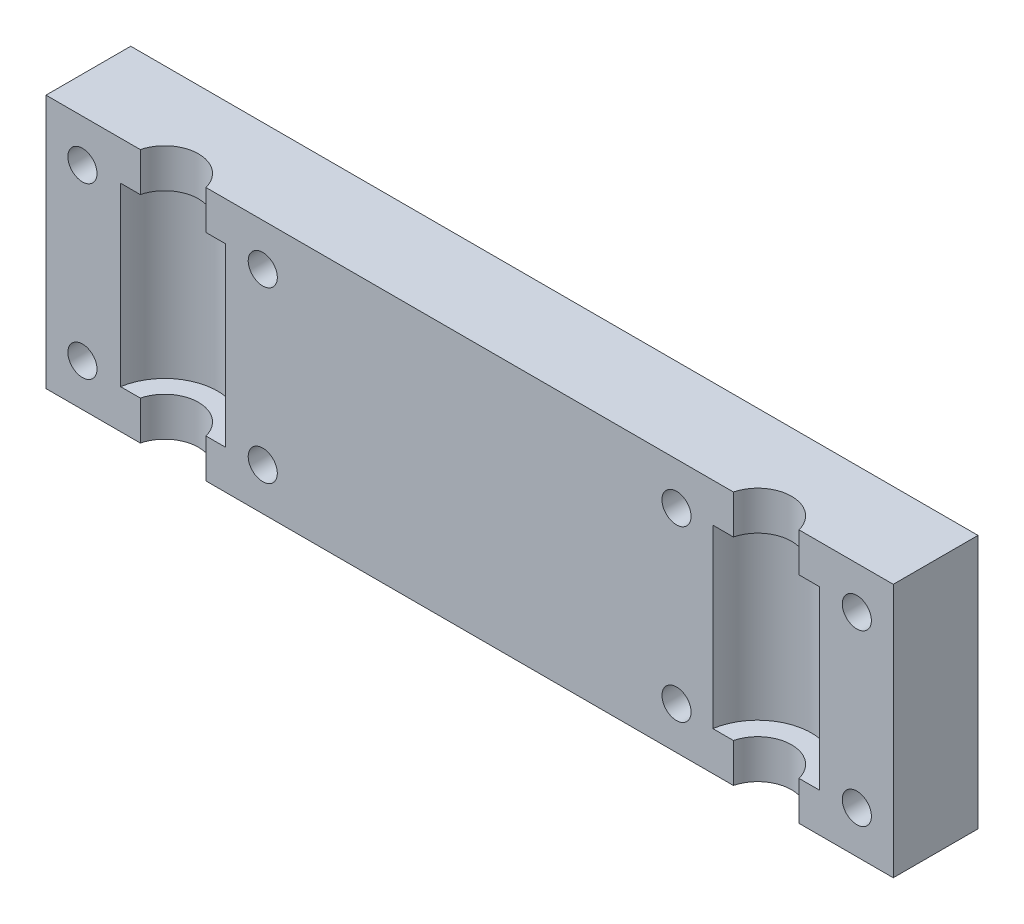
ISO-10303-21;
HEADER;
FILE_DESCRIPTION(('STEP AP214'),'2;1');
FILE_NAME('part.step','',(''),(''),'','','');
FILE_SCHEMA(('AUTOMOTIVE_DESIGN { 1 0 10303 214 1 1 1 1 }'));
ENDSEC;
DATA;
#1=APPLICATION_CONTEXT('core data for automotive mechanical design processes');
#2=APPLICATION_PROTOCOL_DEFINITION('international standard','automotive_design',2000,#1);
#3=PRODUCT_CONTEXT('',#1,'mechanical');
#4=PRODUCT('Part','Part','',(#3));
#5=PRODUCT_RELATED_PRODUCT_CATEGORY('part','',(#4));
#6=PRODUCT_DEFINITION_FORMATION('','',#4);
#7=PRODUCT_DEFINITION_CONTEXT('part definition',#1,'design');
#8=PRODUCT_DEFINITION('design','',#6,#7);
#9=PRODUCT_DEFINITION_SHAPE('','',#8);
#10=(LENGTH_UNIT() NAMED_UNIT(*) SI_UNIT(.MILLI.,.METRE.));
#11=(NAMED_UNIT(*) PLANE_ANGLE_UNIT() SI_UNIT($,.RADIAN.));
#12=(NAMED_UNIT(*) SI_UNIT($,.STERADIAN.) SOLID_ANGLE_UNIT());
#13=UNCERTAINTY_MEASURE_WITH_UNIT(LENGTH_MEASURE(1.E-05),#10,'distance_accuracy_value','');
#14=(GEOMETRIC_REPRESENTATION_CONTEXT(3) GLOBAL_UNCERTAINTY_ASSIGNED_CONTEXT((#13)) GLOBAL_UNIT_ASSIGNED_CONTEXT((#10,
#11,#12)) REPRESENTATION_CONTEXT('',''));
#15=CARTESIAN_POINT('',(0.,0.,0.));
#16=DIRECTION('',(0.,0.,1.));
#17=DIRECTION('',(1.,0.,0.));
#18=AXIS2_PLACEMENT_3D('',#15,#16,#17);
#19=CARTESIAN_POINT('',(-63.5,38.1,12.7));
#20=DIRECTION('',(0.,0.,-1.));
#21=DIRECTION('',(-1.,0.,0.));
#22=AXIS2_PLACEMENT_3D('',#19,#20,#21);
#23=PLANE('',#22);
#24=CARTESIAN_POINT('',(31.0092321055388,31.75,12.7));
#25=DIRECTION('',(0.,0.,-1.));
#26=DIRECTION('',(-1.,0.,0.));
#27=AXIS2_PLACEMENT_3D('',#24,#25,#26);
#28=CIRCLE('',#27,2.18287599999999);
#29=CARTESIAN_POINT('',(28.8263561055388,31.75,12.7));
#30=VERTEX_POINT('',#29);
#31=EDGE_CURVE('E246',#30,#30,#28,.T.);
#32=ORIENTED_EDGE('',*,*,#31,.T.);
#33=EDGE_LOOP('',(#32));
#34=FACE_BOUND('',#33,.T.);
#35=CARTESIAN_POINT('',(31.0092321055388,6.35,12.7));
#36=DIRECTION('',(0.,0.,-1.));
#37=DIRECTION('',(-1.,0.,0.));
#38=AXIS2_PLACEMENT_3D('',#35,#36,#37);
#39=CIRCLE('',#38,2.18287599999999);
#40=CARTESIAN_POINT('',(28.8263561055388,6.35,12.7));
#41=VERTEX_POINT('',#40);
#42=EDGE_CURVE('E242',#41,#41,#39,.T.);
#43=ORIENTED_EDGE('',*,*,#42,.T.);
#44=EDGE_LOOP('',(#43));
#45=FACE_BOUND('',#44,.T.);
#46=CARTESIAN_POINT('',(-31.0092321055388,31.75,12.7));
#47=DIRECTION('',(0.,0.,-1.));
#48=DIRECTION('',(-1.,0.,0.));
#49=AXIS2_PLACEMENT_3D('',#46,#47,#48);
#50=CIRCLE('',#49,2.18287599999999);
#51=CARTESIAN_POINT('',(-33.1921081055388,31.75,12.7));
#52=VERTEX_POINT('',#51);
#53=EDGE_CURVE('E238',#52,#52,#50,.T.);
#54=ORIENTED_EDGE('',*,*,#53,.T.);
#55=EDGE_LOOP('',(#54));
#56=FACE_BOUND('',#55,.T.);
#57=CARTESIAN_POINT('',(-31.0092321055388,6.35,12.7));
#58=DIRECTION('',(0.,0.,-1.));
#59=DIRECTION('',(-1.,0.,0.));
#60=AXIS2_PLACEMENT_3D('',#57,#58,#59);
#61=CIRCLE('',#60,2.18287599999999);
#62=CARTESIAN_POINT('',(-33.1921081055388,6.35,12.7));
#63=VERTEX_POINT('',#62);
#64=EDGE_CURVE('E234',#63,#63,#61,.T.);
#65=ORIENTED_EDGE('',*,*,#64,.T.);
#66=EDGE_LOOP('',(#65));
#67=FACE_BOUND('',#66,.T.);
#68=DIRECTION('',(1.,0.,0.));
#69=VECTOR('',#68,1.);
#70=CARTESIAN_POINT('',(-63.5,0.,12.7));
#71=LINE('',#70,#69);
#72=CARTESIAN_POINT('',(-39.5313111503166,0.,12.7));
#73=VERTEX_POINT('',#72);
#74=CARTESIAN_POINT('',(39.5313111503166,0.,12.7));
#75=VERTEX_POINT('',#74);
#76=EDGE_CURVE('E172',#73,#75,#71,.T.);
#77=ORIENTED_EDGE('',*,*,#76,.T.);
#78=DIRECTION('',(0.,1.,0.));
#79=VECTOR('',#78,1.);
#80=CARTESIAN_POINT('',(39.5313111503166,0.,12.7));
#81=LINE('',#80,#79);
#82=CARTESIAN_POINT('',(39.5313111503166,5.842,12.7));
#83=VERTEX_POINT('',#82);
#84=EDGE_CURVE('E150',#75,#83,#81,.T.);
#85=ORIENTED_EDGE('',*,*,#84,.T.);
#86=DIRECTION('',(1.,0.,0.));
#87=VECTOR('',#86,1.);
#88=CARTESIAN_POINT('',(-63.5,5.842,12.7));
#89=LINE('',#88,#87);
#90=CARTESIAN_POINT('',(36.4475487030535,5.842,12.7));
#91=VERTEX_POINT('',#90);
#92=EDGE_CURVE('E215',#91,#83,#89,.T.);
#93=ORIENTED_EDGE('',*,*,#92,.F.);
#94=DIRECTION('',(0.,-1.,0.));
#95=VECTOR('',#94,1.);
#96=CARTESIAN_POINT('',(36.4475487030535,32.258,12.7));
#97=LINE('',#96,#95);
#98=CARTESIAN_POINT('',(36.4475487030535,32.258,12.7));
#99=VERTEX_POINT('',#98);
#100=EDGE_CURVE('E218',#99,#91,#97,.T.);
#101=ORIENTED_EDGE('',*,*,#100,.F.);
#102=DIRECTION('',(1.,0.,0.));
#103=VECTOR('',#102,1.);
#104=CARTESIAN_POINT('',(-63.5,32.258,12.7));
#105=LINE('',#104,#103);
#106=CARTESIAN_POINT('',(39.5313111503166,32.258,12.7));
#107=VERTEX_POINT('',#106);
#108=EDGE_CURVE('E225',#99,#107,#105,.T.);
#109=ORIENTED_EDGE('',*,*,#108,.T.);
#110=CARTESIAN_POINT('',(39.5313111503166,38.1,12.7));
#111=VERTEX_POINT('',#110);
#112=EDGE_CURVE('E52',#107,#111,#81,.T.);
#113=ORIENTED_EDGE('',*,*,#112,.T.);
#114=DIRECTION('',(1.,0.,0.));
#115=VECTOR('',#114,1.);
#116=CARTESIAN_POINT('',(-63.5,38.1,12.7));
#117=LINE('',#116,#115);
#118=CARTESIAN_POINT('',(-39.5313111503166,38.1,12.7));
#119=VERTEX_POINT('',#118);
#120=EDGE_CURVE('E360',#119,#111,#117,.T.);
#121=ORIENTED_EDGE('',*,*,#120,.F.);
#122=DIRECTION('',(0.,1.,0.));
#123=VECTOR('',#122,1.);
#124=CARTESIAN_POINT('',(-39.5313111503166,0.,12.7));
#125=LINE('',#124,#123);
#126=CARTESIAN_POINT('',(-39.5313111503166,32.258,12.7));
#127=VERTEX_POINT('',#126);
#128=EDGE_CURVE('E290',#119,#127,#125,.F.);
#129=ORIENTED_EDGE('',*,*,#128,.T.);
#130=DIRECTION('',(1.,0.,0.));
#131=VECTOR('',#130,1.);
#132=CARTESIAN_POINT('',(-63.5,32.258,12.7));
#133=LINE('',#132,#131);
#134=CARTESIAN_POINT('',(-36.576163872673,32.258,12.7));
#135=VERTEX_POINT('',#134);
#136=EDGE_CURVE('E211',#127,#135,#133,.T.);
#137=ORIENTED_EDGE('',*,*,#136,.T.);
#138=DIRECTION('',(0.,-1.,0.));
#139=VECTOR('',#138,1.);
#140=CARTESIAN_POINT('',(-36.576163872673,32.258,12.7));
#141=LINE('',#140,#139);
#142=CARTESIAN_POINT('',(-36.576163872673,5.842,12.7));
#143=VERTEX_POINT('',#142);
#144=EDGE_CURVE('E208',#143,#135,#141,.F.);
#145=ORIENTED_EDGE('',*,*,#144,.F.);
#146=DIRECTION('',(1.,0.,0.));
#147=VECTOR('',#146,1.);
#148=CARTESIAN_POINT('',(-63.5,5.842,12.7));
#149=LINE('',#148,#147);
#150=CARTESIAN_POINT('',(-39.5313111503166,5.842,12.7));
#151=VERTEX_POINT('',#150);
#152=EDGE_CURVE('E201',#151,#143,#149,.T.);
#153=ORIENTED_EDGE('',*,*,#152,.F.);
#154=EDGE_CURVE('E284',#151,#73,#125,.F.);
#155=ORIENTED_EDGE('',*,*,#154,.T.);
#156=EDGE_LOOP('',(#77,#85,#93,#101,#109,#113,#121,#129,#137,#145,#153,#155));
#157=FACE_BOUND('',#156,.T.);
#158=ADVANCED_FACE('F35',(#34,#45,#56,#67,#157),#23,.F.);
#159=CARTESIAN_POINT('',(-58.039,6.35,12.7));
#160=DIRECTION('',(0.,0.,-1.));
#161=DIRECTION('',(-1.,0.,0.));
#162=AXIS2_PLACEMENT_3D('',#159,#160,#161);
#163=CIRCLE('',#162,2.18287599999999);
#164=CARTESIAN_POINT('',(-60.221876,6.35,12.7));
#165=VERTEX_POINT('',#164);
#166=EDGE_CURVE('E233',#165,#165,#163,.T.);
#167=ORIENTED_EDGE('',*,*,#166,.T.);
#168=EDGE_LOOP('',(#167));
#169=FACE_BOUND('',#168,.T.);
#170=CARTESIAN_POINT('',(-58.039,31.75,12.7));
#171=DIRECTION('',(0.,0.,-1.));
#172=DIRECTION('',(-1.,0.,0.));
#173=AXIS2_PLACEMENT_3D('',#170,#171,#172);
#174=CIRCLE('',#173,2.18287599999999);
#175=CARTESIAN_POINT('',(-60.221876,31.75,12.7));
#176=VERTEX_POINT('',#175);
#177=EDGE_CURVE('E229',#176,#176,#174,.T.);
#178=ORIENTED_EDGE('',*,*,#177,.T.);
#179=EDGE_LOOP('',(#178));
#180=FACE_BOUND('',#179,.T.);
#181=CARTESIAN_POINT('',(-63.5,0.,12.7));
#182=VERTEX_POINT('',#181);
#183=CARTESIAN_POINT('',(-49.3686888496834,0.,12.7));
#184=VERTEX_POINT('',#183);
#185=EDGE_CURVE('E175',#182,#184,#71,.T.);
#186=ORIENTED_EDGE('',*,*,#185,.T.);
#187=DIRECTION('',(0.,1.,0.));
#188=VECTOR('',#187,1.);
#189=CARTESIAN_POINT('',(-49.3686888496834,0.,12.7));
#190=LINE('',#189,#188);
#191=CARTESIAN_POINT('',(-49.3686888496834,5.842,12.7));
#192=VERTEX_POINT('',#191);
#193=EDGE_CURVE('E289',#184,#192,#190,.T.);
#194=ORIENTED_EDGE('',*,*,#193,.T.);
#195=CARTESIAN_POINT('',(-52.323836127327,5.842,12.7));
#196=VERTEX_POINT('',#195);
#197=EDGE_CURVE('E202',#196,#192,#149,.T.);
#198=ORIENTED_EDGE('',*,*,#197,.F.);
#199=DIRECTION('',(0.,-1.,0.));
#200=VECTOR('',#199,1.);
#201=CARTESIAN_POINT('',(-52.323836127327,32.258,12.7));
#202=LINE('',#201,#200);
#203=CARTESIAN_POINT('',(-52.323836127327,32.258,12.7));
#204=VERTEX_POINT('',#203);
#205=EDGE_CURVE('E205',#204,#196,#202,.T.);
#206=ORIENTED_EDGE('',*,*,#205,.F.);
#207=CARTESIAN_POINT('',(-49.3686888496834,32.258,12.7));
#208=VERTEX_POINT('',#207);
#209=EDGE_CURVE('E212',#204,#208,#133,.T.);
#210=ORIENTED_EDGE('',*,*,#209,.T.);
#211=CARTESIAN_POINT('',(-49.3686888496834,38.1,12.7));
#212=VERTEX_POINT('',#211);
#213=EDGE_CURVE('E293',#208,#212,#190,.T.);
#214=ORIENTED_EDGE('',*,*,#213,.T.);
#215=CARTESIAN_POINT('',(-63.5,38.1,12.7));
#216=VERTEX_POINT('',#215);
#217=EDGE_CURVE('E356',#216,#212,#117,.T.);
#218=ORIENTED_EDGE('',*,*,#217,.F.);
#219=DIRECTION('',(0.,-1.,0.));
#220=VECTOR('',#219,1.);
#221=CARTESIAN_POINT('',(-63.5,38.1,12.7));
#222=LINE('',#221,#220);
#223=EDGE_CURVE('E199',#216,#182,#222,.T.);
#224=ORIENTED_EDGE('',*,*,#223,.T.);
#225=EDGE_LOOP('',(#186,#194,#198,#206,#210,#214,#218,#224));
#226=FACE_BOUND('',#225,.T.);
#227=ADVANCED_FACE('F374',(#169,#180,#226),#23,.F.);
#228=CARTESIAN_POINT('',(-63.5,38.1,0.));
#229=DIRECTION('',(1.,0.,0.));
#230=DIRECTION('',(0.,0.,-1.));
#231=AXIS2_PLACEMENT_3D('',#228,#229,#230);
#232=PLANE('',#231);
#233=DIRECTION('',(0.,0.,1.));
#234=VECTOR('',#233,1.);
#235=CARTESIAN_POINT('',(-63.5,0.,0.));
#236=LINE('',#235,#234);
#237=CARTESIAN_POINT('',(-63.5,0.,0.));
#238=VERTEX_POINT('',#237);
#239=EDGE_CURVE('E173',#238,#182,#236,.T.);
#240=ORIENTED_EDGE('',*,*,#239,.T.);
#241=ORIENTED_EDGE('',*,*,#223,.F.);
#242=DIRECTION('',(0.,0.,1.));
#243=VECTOR('',#242,1.);
#244=CARTESIAN_POINT('',(-63.5,38.1,0.));
#245=LINE('',#244,#243);
#246=CARTESIAN_POINT('',(-63.5,38.1,0.));
#247=VERTEX_POINT('',#246);
#248=EDGE_CURVE('E188',#247,#216,#245,.T.);
#249=ORIENTED_EDGE('',*,*,#248,.F.);
#250=DIRECTION('',(0.,-1.,0.));
#251=VECTOR('',#250,1.);
#252=CARTESIAN_POINT('',(-63.5,38.1,0.));
#253=LINE('',#252,#251);
#254=EDGE_CURVE('E191',#247,#238,#253,.T.);
#255=ORIENTED_EDGE('',*,*,#254,.T.);
#256=EDGE_LOOP('',(#240,#241,#249,#255));
#257=FACE_BOUND('',#256,.T.);
#258=ADVANCED_FACE('F37',(#257),#232,.F.);
#259=CARTESIAN_POINT('',(58.039,31.75,12.7));
#260=DIRECTION('',(0.,0.,-1.));
#261=DIRECTION('',(-1.,0.,0.));
#262=AXIS2_PLACEMENT_3D('',#259,#260,#261);
#263=CIRCLE('',#262,2.18287599999999);
#264=CARTESIAN_POINT('',(55.856124,31.75,12.7));
#265=VERTEX_POINT('',#264);
#266=EDGE_CURVE('E39',#265,#265,#263,.T.);
#267=ORIENTED_EDGE('',*,*,#266,.T.);
#268=EDGE_LOOP('',(#267));
#269=FACE_BOUND('',#268,.T.);
#270=CARTESIAN_POINT('',(58.039,6.35,12.7));
#271=DIRECTION('',(0.,0.,-1.));
#272=DIRECTION('',(-1.,0.,0.));
#273=AXIS2_PLACEMENT_3D('',#270,#271,#272);
#274=CIRCLE('',#273,2.18287599999999);
#275=CARTESIAN_POINT('',(55.856124,6.35,12.7));
#276=VERTEX_POINT('',#275);
#277=EDGE_CURVE('E249',#276,#276,#274,.T.);
#278=ORIENTED_EDGE('',*,*,#277,.T.);
#279=EDGE_LOOP('',(#278));
#280=FACE_BOUND('',#279,.T.);
#281=CARTESIAN_POINT('',(49.3686888496834,38.1,12.7));
#282=VERTEX_POINT('',#281);
#283=CARTESIAN_POINT('',(63.5,38.1,12.7));
#284=VERTEX_POINT('',#283);
#285=EDGE_CURVE('E355',#282,#284,#117,.T.);
#286=ORIENTED_EDGE('',*,*,#285,.F.);
#287=DIRECTION('',(0.,1.,0.));
#288=VECTOR('',#287,1.);
#289=CARTESIAN_POINT('',(49.3686888496834,0.,12.7));
#290=LINE('',#289,#288);
#291=CARTESIAN_POINT('',(49.3686888496834,32.258,12.7));
#292=VERTEX_POINT('',#291);
#293=EDGE_CURVE('E167',#282,#292,#290,.F.);
#294=ORIENTED_EDGE('',*,*,#293,.T.);
#295=CARTESIAN_POINT('',(52.4524512969464,32.258,12.7));
#296=VERTEX_POINT('',#295);
#297=EDGE_CURVE('E224',#292,#296,#105,.T.);
#298=ORIENTED_EDGE('',*,*,#297,.T.);
#299=DIRECTION('',(0.,-1.,0.));
#300=VECTOR('',#299,1.);
#301=CARTESIAN_POINT('',(52.4524512969464,32.258,12.7));
#302=LINE('',#301,#300);
#303=CARTESIAN_POINT('',(52.4524512969464,5.842,12.7));
#304=VERTEX_POINT('',#303);
#305=EDGE_CURVE('E221',#304,#296,#302,.F.);
#306=ORIENTED_EDGE('',*,*,#305,.F.);
#307=CARTESIAN_POINT('',(49.3686888496834,5.842,12.7));
#308=VERTEX_POINT('',#307);
#309=EDGE_CURVE('E165',#308,#304,#89,.T.);
#310=ORIENTED_EDGE('',*,*,#309,.F.);
#311=CARTESIAN_POINT('',(49.3686888496834,0.,12.7));
#312=VERTEX_POINT('',#311);
#313=EDGE_CURVE('E59',#308,#312,#290,.F.);
#314=ORIENTED_EDGE('',*,*,#313,.T.);
#315=CARTESIAN_POINT('',(63.5,0.,12.7));
#316=VERTEX_POINT('',#315);
#317=EDGE_CURVE('E162',#312,#316,#71,.T.);
#318=ORIENTED_EDGE('',*,*,#317,.T.);
#319=DIRECTION('',(0.,-1.,0.));
#320=VECTOR('',#319,1.);
#321=CARTESIAN_POINT('',(63.5,38.1,12.7));
#322=LINE('',#321,#320);
#323=EDGE_CURVE('E197',#284,#316,#322,.T.);
#324=ORIENTED_EDGE('',*,*,#323,.F.);
#325=EDGE_LOOP('',(#286,#294,#298,#306,#310,#314,#318,#324));
#326=FACE_BOUND('',#325,.T.);
#327=ADVANCED_FACE('F160',(#269,#280,#326),#23,.F.);
#328=CARTESIAN_POINT('',(63.5,38.1,0.));
#329=DIRECTION('',(-1.,0.,0.));
#330=DIRECTION('',(0.,0.,1.));
#331=AXIS2_PLACEMENT_3D('',#328,#329,#330);
#332=PLANE('',#331);
#333=DIRECTION('',(0.,0.,-1.));
#334=VECTOR('',#333,1.);
#335=CARTESIAN_POINT('',(63.5,0.,0.));
#336=LINE('',#335,#334);
#337=CARTESIAN_POINT('',(63.5,0.,0.));
#338=VERTEX_POINT('',#337);
#339=EDGE_CURVE('E171',#316,#338,#336,.T.);
#340=ORIENTED_EDGE('',*,*,#339,.T.);
#341=DIRECTION('',(0.,-1.,0.));
#342=VECTOR('',#341,1.);
#343=CARTESIAN_POINT('',(63.5,38.1,0.));
#344=LINE('',#343,#342);
#345=CARTESIAN_POINT('',(63.5,38.1,0.));
#346=VERTEX_POINT('',#345);
#347=EDGE_CURVE('E194',#346,#338,#344,.T.);
#348=ORIENTED_EDGE('',*,*,#347,.F.);
#349=DIRECTION('',(0.,0.,-1.));
#350=VECTOR('',#349,1.);
#351=CARTESIAN_POINT('',(63.5,38.1,0.));
#352=LINE('',#351,#350);
#353=EDGE_CURVE('E359',#284,#346,#352,.T.);
#354=ORIENTED_EDGE('',*,*,#353,.F.);
#355=ORIENTED_EDGE('',*,*,#323,.T.);
#356=EDGE_LOOP('',(#340,#348,#354,#355));
#357=FACE_BOUND('',#356,.T.);
#358=ADVANCED_FACE('F384',(#357),#332,.F.);
#359=CARTESIAN_POINT('',(-63.5,38.1,0.));
#360=DIRECTION('',(0.,0.,1.));
#361=DIRECTION('',(1.,0.,0.));
#362=AXIS2_PLACEMENT_3D('',#359,#360,#361);
#363=PLANE('',#362);
#364=CARTESIAN_POINT('',(31.0092321055388,6.35,0.));
#365=DIRECTION('',(0.,0.,-1.));
#366=DIRECTION('',(-1.,0.,0.));
#367=AXIS2_PLACEMENT_3D('',#364,#365,#366);
#368=CIRCLE('',#367,4.445);
#369=CARTESIAN_POINT('',(26.5642321055388,6.35,0.));
#370=VERTEX_POINT('',#369);
#371=EDGE_CURVE('E307',#370,#370,#368,.T.);
#372=ORIENTED_EDGE('',*,*,#371,.F.);
#373=EDGE_LOOP('',(#372));
#374=FACE_BOUND('',#373,.T.);
#375=CARTESIAN_POINT('',(-31.0092321055388,31.75,0.));
#376=DIRECTION('',(0.,0.,-1.));
#377=DIRECTION('',(-1.,0.,0.));
#378=AXIS2_PLACEMENT_3D('',#375,#376,#377);
#379=CIRCLE('',#378,4.445);
#380=CARTESIAN_POINT('',(-35.4542321055388,31.75,0.));
#381=VERTEX_POINT('',#380);
#382=EDGE_CURVE('E313',#381,#381,#379,.T.);
#383=ORIENTED_EDGE('',*,*,#382,.F.);
#384=EDGE_LOOP('',(#383));
#385=FACE_BOUND('',#384,.T.);
#386=CARTESIAN_POINT('',(-31.0092321055388,6.35,0.));
#387=DIRECTION('',(0.,0.,-1.));
#388=DIRECTION('',(-1.,0.,0.));
#389=AXIS2_PLACEMENT_3D('',#386,#387,#388);
#390=CIRCLE('',#389,4.445);
#391=CARTESIAN_POINT('',(-35.4542321055388,6.35,0.));
#392=VERTEX_POINT('',#391);
#393=EDGE_CURVE('E319',#392,#392,#390,.T.);
#394=ORIENTED_EDGE('',*,*,#393,.F.);
#395=EDGE_LOOP('',(#394));
#396=FACE_BOUND('',#395,.T.);
#397=CARTESIAN_POINT('',(-58.039,6.35,0.));
#398=DIRECTION('',(0.,0.,-1.));
#399=DIRECTION('',(-1.,0.,0.));
#400=AXIS2_PLACEMENT_3D('',#397,#398,#399);
#401=CIRCLE('',#400,4.44499999999999);
#402=CARTESIAN_POINT('',(-62.484,6.35,0.));
#403=VERTEX_POINT('',#402);
#404=EDGE_CURVE('E325',#403,#403,#401,.T.);
#405=ORIENTED_EDGE('',*,*,#404,.F.);
#406=EDGE_LOOP('',(#405));
#407=FACE_BOUND('',#406,.T.);
#408=CARTESIAN_POINT('',(-58.039,31.75,0.));
#409=DIRECTION('',(0.,0.,-1.));
#410=DIRECTION('',(-1.,0.,0.));
#411=AXIS2_PLACEMENT_3D('',#408,#409,#410);
#412=CIRCLE('',#411,4.44499999999998);
#413=CARTESIAN_POINT('',(-62.484,31.75,0.));
#414=VERTEX_POINT('',#413);
#415=EDGE_CURVE('E331',#414,#414,#412,.T.);
#416=ORIENTED_EDGE('',*,*,#415,.F.);
#417=EDGE_LOOP('',(#416));
#418=FACE_BOUND('',#417,.T.);
#419=CARTESIAN_POINT('',(58.039,31.75,0.));
#420=DIRECTION('',(0.,0.,-1.));
#421=DIRECTION('',(-1.,0.,0.));
#422=AXIS2_PLACEMENT_3D('',#419,#420,#421);
#423=CIRCLE('',#422,4.44499999999998);
#424=CARTESIAN_POINT('',(53.594,31.75,0.));
#425=VERTEX_POINT('',#424);
#426=EDGE_CURVE('E337',#425,#425,#423,.T.);
#427=ORIENTED_EDGE('',*,*,#426,.F.);
#428=EDGE_LOOP('',(#427));
#429=FACE_BOUND('',#428,.T.);
#430=CARTESIAN_POINT('',(58.039,6.35,0.));
#431=DIRECTION('',(0.,0.,-1.));
#432=DIRECTION('',(-1.,0.,0.));
#433=AXIS2_PLACEMENT_3D('',#430,#431,#432);
#434=CIRCLE('',#433,4.44499999999999);
#435=CARTESIAN_POINT('',(53.594,6.35,0.));
#436=VERTEX_POINT('',#435);
#437=EDGE_CURVE('E343',#436,#436,#434,.T.);
#438=ORIENTED_EDGE('',*,*,#437,.F.);
#439=EDGE_LOOP('',(#438));
#440=FACE_BOUND('',#439,.T.);
#441=CARTESIAN_POINT('',(31.0092321055388,31.75,0.));
#442=DIRECTION('',(0.,0.,-1.));
#443=DIRECTION('',(-1.,0.,0.));
#444=AXIS2_PLACEMENT_3D('',#441,#442,#443);
#445=CIRCLE('',#444,4.445);
#446=CARTESIAN_POINT('',(26.5642321055388,31.75,0.));
#447=VERTEX_POINT('',#446);
#448=EDGE_CURVE('E346',#447,#447,#445,.T.);
#449=ORIENTED_EDGE('',*,*,#448,.F.);
#450=EDGE_LOOP('',(#449));
#451=FACE_BOUND('',#450,.T.);
#452=DIRECTION('',(-1.,0.,0.));
#453=VECTOR('',#452,1.);
#454=CARTESIAN_POINT('',(-63.5,0.,0.));
#455=LINE('',#454,#453);
#456=EDGE_CURVE('E184',#338,#238,#455,.T.);
#457=ORIENTED_EDGE('',*,*,#456,.T.);
#458=ORIENTED_EDGE('',*,*,#254,.F.);
#459=DIRECTION('',(-1.,0.,0.));
#460=VECTOR('',#459,1.);
#461=CARTESIAN_POINT('',(-63.5,38.1,0.));
#462=LINE('',#461,#460);
#463=EDGE_CURVE('E195',#346,#247,#462,.T.);
#464=ORIENTED_EDGE('',*,*,#463,.F.);
#465=ORIENTED_EDGE('',*,*,#347,.T.);
#466=EDGE_LOOP('',(#457,#458,#464,#465));
#467=FACE_BOUND('',#466,.T.);
#468=ADVANCED_FACE('F371',(#374,#385,#396,#407,#418,#429,#440,#451,#467),#363,.F.);
#469=CARTESIAN_POINT('',(0.,38.1,0.));
#470=DIRECTION('',(0.,1.,0.));
#471=DIRECTION('',(0.,0.,1.));
#472=AXIS2_PLACEMENT_3D('',#469,#470,#471);
#473=PLANE('',#472);
#474=CARTESIAN_POINT('',(44.45,38.1,13.97));
#475=DIRECTION('',(0.,1.,0.));
#476=DIRECTION('',(0.,0.,1.));
#477=AXIS2_PLACEMENT_3D('',#474,#475,#476);
#478=CIRCLE('',#477,5.08);
#479=EDGE_CURVE('E155',#282,#111,#478,.T.);
#480=ORIENTED_EDGE('',*,*,#479,.F.);
#481=ORIENTED_EDGE('',*,*,#285,.T.);
#482=ORIENTED_EDGE('',*,*,#353,.T.);
#483=ORIENTED_EDGE('',*,*,#463,.T.);
#484=ORIENTED_EDGE('',*,*,#248,.T.);
#485=ORIENTED_EDGE('',*,*,#217,.T.);
#486=CARTESIAN_POINT('',(-44.45,38.1,13.97));
#487=DIRECTION('',(0.,1.,0.));
#488=DIRECTION('',(0.,0.,1.));
#489=AXIS2_PLACEMENT_3D('',#486,#487,#488);
#490=CIRCLE('',#489,5.08);
#491=EDGE_CURVE('E285',#119,#212,#490,.T.);
#492=ORIENTED_EDGE('',*,*,#491,.F.);
#493=ORIENTED_EDGE('',*,*,#120,.T.);
#494=EDGE_LOOP('',(#480,#481,#482,#483,#484,#485,#492,#493));
#495=FACE_BOUND('',#494,.T.);
#496=ADVANCED_FACE('F366',(#495),#473,.T.);
#497=CARTESIAN_POINT('',(0.,0.,0.));
#498=DIRECTION('',(0.,1.,0.));
#499=DIRECTION('',(0.,0.,1.));
#500=AXIS2_PLACEMENT_3D('',#497,#498,#499);
#501=PLANE('',#500);
#502=ORIENTED_EDGE('',*,*,#317,.F.);
#503=CARTESIAN_POINT('',(44.45,0.,13.97));
#504=DIRECTION('',(0.,1.,0.));
#505=DIRECTION('',(0.,0.,1.));
#506=AXIS2_PLACEMENT_3D('',#503,#504,#505);
#507=CIRCLE('',#506,5.08);
#508=EDGE_CURVE('E147',#312,#75,#507,.T.);
#509=ORIENTED_EDGE('',*,*,#508,.T.);
#510=ORIENTED_EDGE('',*,*,#76,.F.);
#511=CARTESIAN_POINT('',(-44.45,0.,13.97));
#512=DIRECTION('',(0.,1.,0.));
#513=DIRECTION('',(0.,0.,1.));
#514=AXIS2_PLACEMENT_3D('',#511,#512,#513);
#515=CIRCLE('',#514,5.08);
#516=EDGE_CURVE('E281',#73,#184,#515,.T.);
#517=ORIENTED_EDGE('',*,*,#516,.T.);
#518=ORIENTED_EDGE('',*,*,#185,.F.);
#519=ORIENTED_EDGE('',*,*,#239,.F.);
#520=ORIENTED_EDGE('',*,*,#456,.F.);
#521=ORIENTED_EDGE('',*,*,#339,.F.);
#522=EDGE_LOOP('',(#502,#509,#510,#517,#518,#519,#520,#521));
#523=FACE_BOUND('',#522,.T.);
#524=ADVANCED_FACE('F169',(#523),#501,.F.);
#525=CARTESIAN_POINT('',(31.0092321055388,31.75,2.54));
#526=DIRECTION('',(0.,0.,-1.));
#527=DIRECTION('',(-1.,0.,0.));
#528=AXIS2_PLACEMENT_3D('',#525,#526,#527);
#529=CYLINDRICAL_SURFACE('',#528,4.445);
#530=CARTESIAN_POINT('',(31.0092321055388,31.75,2.54));
#531=DIRECTION('',(0.,0.,-1.));
#532=DIRECTION('',(-1.,0.,0.));
#533=AXIS2_PLACEMENT_3D('',#530,#531,#532);
#534=CIRCLE('',#533,4.445);
#535=CARTESIAN_POINT('',(26.5642321055388,31.75,2.54));
#536=VERTEX_POINT('',#535);
#537=EDGE_CURVE('E177',#536,#536,#534,.T.);
#538=ORIENTED_EDGE('',*,*,#537,.F.);
#539=EDGE_LOOP('',(#538));
#540=FACE_BOUND('',#539,.T.);
#541=ORIENTED_EDGE('',*,*,#448,.T.);
#542=EDGE_LOOP('',(#541));
#543=FACE_BOUND('',#542,.T.);
#544=ADVANCED_FACE('F547',(#540,#543),#529,.F.);
#545=CARTESIAN_POINT('',(31.0092321055388,31.75,2.54));
#546=DIRECTION('',(0.,0.,-1.));
#547=DIRECTION('',(-1.,0.,0.));
#548=AXIS2_PLACEMENT_3D('',#545,#546,#547);
#549=PLANE('',#548);
#550=CARTESIAN_POINT('',(31.0092321055388,31.75,2.54));
#551=DIRECTION('',(0.,0.,-1.));
#552=DIRECTION('',(-1.,0.,0.));
#553=AXIS2_PLACEMENT_3D('',#550,#551,#552);
#554=CIRCLE('',#553,2.18287599999999);
#555=CARTESIAN_POINT('',(28.8263561055388,31.75,2.54));
#556=VERTEX_POINT('',#555);
#557=EDGE_CURVE('E247',#556,#556,#554,.T.);
#558=ORIENTED_EDGE('',*,*,#557,.F.);
#559=EDGE_LOOP('',(#558));
#560=FACE_BOUND('',#559,.T.);
#561=ORIENTED_EDGE('',*,*,#537,.T.);
#562=EDGE_LOOP('',(#561));
#563=FACE_BOUND('',#562,.T.);
#564=ADVANCED_FACE('F540',(#560,#563),#549,.T.);
#565=CARTESIAN_POINT('',(58.039,6.35,2.54));
#566=DIRECTION('',(0.,0.,-1.));
#567=DIRECTION('',(-1.,0.,0.));
#568=AXIS2_PLACEMENT_3D('',#565,#566,#567);
#569=CYLINDRICAL_SURFACE('',#568,4.44499999999999);
#570=CARTESIAN_POINT('',(58.039,6.35,2.54));
#571=DIRECTION('',(0.,0.,-1.));
#572=DIRECTION('',(-1.,0.,0.));
#573=AXIS2_PLACEMENT_3D('',#570,#571,#572);
#574=CIRCLE('',#573,4.44499999999999);
#575=CARTESIAN_POINT('',(53.594,6.35,2.54));
#576=VERTEX_POINT('',#575);
#577=EDGE_CURVE('E340',#576,#576,#574,.T.);
#578=ORIENTED_EDGE('',*,*,#577,.F.);
#579=EDGE_LOOP('',(#578));
#580=FACE_BOUND('',#579,.T.);
#581=ORIENTED_EDGE('',*,*,#437,.T.);
#582=EDGE_LOOP('',(#581));
#583=FACE_BOUND('',#582,.T.);
#584=ADVANCED_FACE('F537',(#580,#583),#569,.F.);
#585=CARTESIAN_POINT('',(58.039,6.35,2.54));
#586=DIRECTION('',(0.,0.,-1.));
#587=DIRECTION('',(-1.,0.,0.));
#588=AXIS2_PLACEMENT_3D('',#585,#586,#587);
#589=PLANE('',#588);
#590=CARTESIAN_POINT('',(58.039,6.35,2.54));
#591=DIRECTION('',(0.,0.,-1.));
#592=DIRECTION('',(-1.,0.,0.));
#593=AXIS2_PLACEMENT_3D('',#590,#591,#592);
#594=CIRCLE('',#593,2.18287599999999);
#595=CARTESIAN_POINT('',(55.856124,6.35,2.54));
#596=VERTEX_POINT('',#595);
#597=EDGE_CURVE('E251',#596,#596,#594,.T.);
#598=ORIENTED_EDGE('',*,*,#597,.F.);
#599=EDGE_LOOP('',(#598));
#600=FACE_BOUND('',#599,.T.);
#601=ORIENTED_EDGE('',*,*,#577,.T.);
#602=EDGE_LOOP('',(#601));
#603=FACE_BOUND('',#602,.T.);
#604=ADVANCED_FACE('F532',(#600,#603),#589,.T.);
#605=CARTESIAN_POINT('',(58.039,31.75,2.54));
#606=DIRECTION('',(0.,0.,-1.));
#607=DIRECTION('',(-1.,0.,0.));
#608=AXIS2_PLACEMENT_3D('',#605,#606,#607);
#609=CYLINDRICAL_SURFACE('',#608,4.44499999999998);
#610=CARTESIAN_POINT('',(58.039,31.75,2.54));
#611=DIRECTION('',(0.,0.,-1.));
#612=DIRECTION('',(-1.,0.,0.));
#613=AXIS2_PLACEMENT_3D('',#610,#611,#612);
#614=CIRCLE('',#613,4.44499999999998);
#615=CARTESIAN_POINT('',(53.594,31.75,2.54));
#616=VERTEX_POINT('',#615);
#617=EDGE_CURVE('E334',#616,#616,#614,.T.);
#618=ORIENTED_EDGE('',*,*,#617,.F.);
#619=EDGE_LOOP('',(#618));
#620=FACE_BOUND('',#619,.T.);
#621=ORIENTED_EDGE('',*,*,#426,.T.);
#622=EDGE_LOOP('',(#621));
#623=FACE_BOUND('',#622,.T.);
#624=ADVANCED_FACE('F529',(#620,#623),#609,.F.);
#625=CARTESIAN_POINT('',(58.039,31.75,2.54));
#626=DIRECTION('',(0.,0.,-1.));
#627=DIRECTION('',(-1.,0.,0.));
#628=AXIS2_PLACEMENT_3D('',#625,#626,#627);
#629=PLANE('',#628);
#630=CARTESIAN_POINT('',(58.039,31.75,2.54));
#631=DIRECTION('',(0.,0.,-1.));
#632=DIRECTION('',(-1.,0.,0.));
#633=AXIS2_PLACEMENT_3D('',#630,#631,#632);
#634=CIRCLE('',#633,2.18287599999999);
#635=CARTESIAN_POINT('',(55.856124,31.75,2.54));
#636=VERTEX_POINT('',#635);
#637=EDGE_CURVE('E255',#636,#636,#634,.T.);
#638=ORIENTED_EDGE('',*,*,#637,.F.);
#639=EDGE_LOOP('',(#638));
#640=FACE_BOUND('',#639,.T.);
#641=ORIENTED_EDGE('',*,*,#617,.T.);
#642=EDGE_LOOP('',(#641));
#643=FACE_BOUND('',#642,.T.);
#644=ADVANCED_FACE('F524',(#640,#643),#629,.T.);
#645=CARTESIAN_POINT('',(-58.039,31.75,2.54));
#646=DIRECTION('',(0.,0.,-1.));
#647=DIRECTION('',(-1.,0.,0.));
#648=AXIS2_PLACEMENT_3D('',#645,#646,#647);
#649=CYLINDRICAL_SURFACE('',#648,4.44499999999998);
#650=CARTESIAN_POINT('',(-58.039,31.75,2.54));
#651=DIRECTION('',(0.,0.,-1.));
#652=DIRECTION('',(-1.,0.,0.));
#653=AXIS2_PLACEMENT_3D('',#650,#651,#652);
#654=CIRCLE('',#653,4.44499999999998);
#655=CARTESIAN_POINT('',(-62.484,31.75,2.54));
#656=VERTEX_POINT('',#655);
#657=EDGE_CURVE('E328',#656,#656,#654,.T.);
#658=ORIENTED_EDGE('',*,*,#657,.F.);
#659=EDGE_LOOP('',(#658));
#660=FACE_BOUND('',#659,.T.);
#661=ORIENTED_EDGE('',*,*,#415,.T.);
#662=EDGE_LOOP('',(#661));
#663=FACE_BOUND('',#662,.T.);
#664=ADVANCED_FACE('F521',(#660,#663),#649,.F.);
#665=CARTESIAN_POINT('',(-58.039,31.75,2.54));
#666=DIRECTION('',(0.,0.,-1.));
#667=DIRECTION('',(-1.,0.,0.));
#668=AXIS2_PLACEMENT_3D('',#665,#666,#667);
#669=PLANE('',#668);
#670=CARTESIAN_POINT('',(-58.039,31.75,2.54));
#671=DIRECTION('',(0.,0.,-1.));
#672=DIRECTION('',(-1.,0.,0.));
#673=AXIS2_PLACEMENT_3D('',#670,#671,#672);
#674=CIRCLE('',#673,2.18287599999999);
#675=CARTESIAN_POINT('',(-60.221876,31.75,2.54));
#676=VERTEX_POINT('',#675);
#677=EDGE_CURVE('E232',#676,#676,#674,.T.);
#678=ORIENTED_EDGE('',*,*,#677,.F.);
#679=EDGE_LOOP('',(#678));
#680=FACE_BOUND('',#679,.T.);
#681=ORIENTED_EDGE('',*,*,#657,.T.);
#682=EDGE_LOOP('',(#681));
#683=FACE_BOUND('',#682,.T.);
#684=ADVANCED_FACE('F516',(#680,#683),#669,.T.);
#685=CARTESIAN_POINT('',(-58.039,6.35,2.54));
#686=DIRECTION('',(0.,0.,-1.));
#687=DIRECTION('',(-1.,0.,0.));
#688=AXIS2_PLACEMENT_3D('',#685,#686,#687);
#689=CYLINDRICAL_SURFACE('',#688,4.44499999999999);
#690=CARTESIAN_POINT('',(-58.039,6.35,2.54));
#691=DIRECTION('',(0.,0.,-1.));
#692=DIRECTION('',(-1.,0.,0.));
#693=AXIS2_PLACEMENT_3D('',#690,#691,#692);
#694=CIRCLE('',#693,4.44499999999999);
#695=CARTESIAN_POINT('',(-62.484,6.35,2.54));
#696=VERTEX_POINT('',#695);
#697=EDGE_CURVE('E322',#696,#696,#694,.T.);
#698=ORIENTED_EDGE('',*,*,#697,.F.);
#699=EDGE_LOOP('',(#698));
#700=FACE_BOUND('',#699,.T.);
#701=ORIENTED_EDGE('',*,*,#404,.T.);
#702=EDGE_LOOP('',(#701));
#703=FACE_BOUND('',#702,.T.);
#704=ADVANCED_FACE('F513',(#700,#703),#689,.F.);
#705=CARTESIAN_POINT('',(-58.039,6.35,2.54));
#706=DIRECTION('',(0.,0.,-1.));
#707=DIRECTION('',(-1.,0.,0.));
#708=AXIS2_PLACEMENT_3D('',#705,#706,#707);
#709=PLANE('',#708);
#710=CARTESIAN_POINT('',(-58.039,6.35,2.54));
#711=DIRECTION('',(0.,0.,-1.));
#712=DIRECTION('',(-1.,0.,0.));
#713=AXIS2_PLACEMENT_3D('',#710,#711,#712);
#714=CIRCLE('',#713,2.18287599999999);
#715=CARTESIAN_POINT('',(-60.221876,6.35,2.54));
#716=VERTEX_POINT('',#715);
#717=EDGE_CURVE('E270',#716,#716,#714,.T.);
#718=ORIENTED_EDGE('',*,*,#717,.F.);
#719=EDGE_LOOP('',(#718));
#720=FACE_BOUND('',#719,.T.);
#721=ORIENTED_EDGE('',*,*,#697,.T.);
#722=EDGE_LOOP('',(#721));
#723=FACE_BOUND('',#722,.T.);
#724=ADVANCED_FACE('F508',(#720,#723),#709,.T.);
#725=CARTESIAN_POINT('',(-31.0092321055388,6.35,2.54));
#726=DIRECTION('',(0.,0.,-1.));
#727=DIRECTION('',(-1.,0.,0.));
#728=AXIS2_PLACEMENT_3D('',#725,#726,#727);
#729=CYLINDRICAL_SURFACE('',#728,4.445);
#730=CARTESIAN_POINT('',(-31.0092321055388,6.35,2.54));
#731=DIRECTION('',(0.,0.,-1.));
#732=DIRECTION('',(-1.,0.,0.));
#733=AXIS2_PLACEMENT_3D('',#730,#731,#732);
#734=CIRCLE('',#733,4.445);
#735=CARTESIAN_POINT('',(-35.4542321055388,6.35,2.54));
#736=VERTEX_POINT('',#735);
#737=EDGE_CURVE('E316',#736,#736,#734,.T.);
#738=ORIENTED_EDGE('',*,*,#737,.F.);
#739=EDGE_LOOP('',(#738));
#740=FACE_BOUND('',#739,.T.);
#741=ORIENTED_EDGE('',*,*,#393,.T.);
#742=EDGE_LOOP('',(#741));
#743=FACE_BOUND('',#742,.T.);
#744=ADVANCED_FACE('F505',(#740,#743),#729,.F.);
#745=CARTESIAN_POINT('',(-31.0092321055388,6.35,2.54));
#746=DIRECTION('',(0.,0.,-1.));
#747=DIRECTION('',(-1.,0.,0.));
#748=AXIS2_PLACEMENT_3D('',#745,#746,#747);
#749=PLANE('',#748);
#750=CARTESIAN_POINT('',(-31.0092321055388,6.35,2.54));
#751=DIRECTION('',(0.,0.,-1.));
#752=DIRECTION('',(-1.,0.,0.));
#753=AXIS2_PLACEMENT_3D('',#750,#751,#752);
#754=CIRCLE('',#753,2.18287599999999);
#755=CARTESIAN_POINT('',(-33.1921081055388,6.35,2.54));
#756=VERTEX_POINT('',#755);
#757=EDGE_CURVE('E237',#756,#756,#754,.T.);
#758=ORIENTED_EDGE('',*,*,#757,.F.);
#759=EDGE_LOOP('',(#758));
#760=FACE_BOUND('',#759,.T.);
#761=ORIENTED_EDGE('',*,*,#737,.T.);
#762=EDGE_LOOP('',(#761));
#763=FACE_BOUND('',#762,.T.);
#764=ADVANCED_FACE('F500',(#760,#763),#749,.T.);
#765=CARTESIAN_POINT('',(-31.0092321055388,31.75,2.54));
#766=DIRECTION('',(0.,0.,-1.));
#767=DIRECTION('',(-1.,0.,0.));
#768=AXIS2_PLACEMENT_3D('',#765,#766,#767);
#769=CYLINDRICAL_SURFACE('',#768,4.445);
#770=CARTESIAN_POINT('',(-31.0092321055388,31.75,2.54));
#771=DIRECTION('',(0.,0.,-1.));
#772=DIRECTION('',(-1.,0.,0.));
#773=AXIS2_PLACEMENT_3D('',#770,#771,#772);
#774=CIRCLE('',#773,4.445);
#775=CARTESIAN_POINT('',(-35.4542321055388,31.75,2.54));
#776=VERTEX_POINT('',#775);
#777=EDGE_CURVE('E310',#776,#776,#774,.T.);
#778=ORIENTED_EDGE('',*,*,#777,.F.);
#779=EDGE_LOOP('',(#778));
#780=FACE_BOUND('',#779,.T.);
#781=ORIENTED_EDGE('',*,*,#382,.T.);
#782=EDGE_LOOP('',(#781));
#783=FACE_BOUND('',#782,.T.);
#784=ADVANCED_FACE('F497',(#780,#783),#769,.F.);
#785=CARTESIAN_POINT('',(-31.0092321055388,31.75,2.54));
#786=DIRECTION('',(0.,0.,-1.));
#787=DIRECTION('',(-1.,0.,0.));
#788=AXIS2_PLACEMENT_3D('',#785,#786,#787);
#789=PLANE('',#788);
#790=CARTESIAN_POINT('',(-31.0092321055388,31.75,2.54));
#791=DIRECTION('',(0.,0.,-1.));
#792=DIRECTION('',(-1.,0.,0.));
#793=AXIS2_PLACEMENT_3D('',#790,#791,#792);
#794=CIRCLE('',#793,2.18287599999999);
#795=CARTESIAN_POINT('',(-33.1921081055388,31.75,2.54));
#796=VERTEX_POINT('',#795);
#797=EDGE_CURVE('E241',#796,#796,#794,.T.);
#798=ORIENTED_EDGE('',*,*,#797,.F.);
#799=EDGE_LOOP('',(#798));
#800=FACE_BOUND('',#799,.T.);
#801=ORIENTED_EDGE('',*,*,#777,.T.);
#802=EDGE_LOOP('',(#801));
#803=FACE_BOUND('',#802,.T.);
#804=ADVANCED_FACE('F492',(#800,#803),#789,.T.);
#805=CARTESIAN_POINT('',(31.0092321055388,6.35,2.54));
#806=DIRECTION('',(0.,0.,-1.));
#807=DIRECTION('',(-1.,0.,0.));
#808=AXIS2_PLACEMENT_3D('',#805,#806,#807);
#809=CYLINDRICAL_SURFACE('',#808,4.445);
#810=CARTESIAN_POINT('',(31.0092321055388,6.35,2.54));
#811=DIRECTION('',(0.,0.,-1.));
#812=DIRECTION('',(-1.,0.,0.));
#813=AXIS2_PLACEMENT_3D('',#810,#811,#812);
#814=CIRCLE('',#813,4.445);
#815=CARTESIAN_POINT('',(26.5642321055388,6.35,2.54));
#816=VERTEX_POINT('',#815);
#817=EDGE_CURVE('E306',#816,#816,#814,.T.);
#818=ORIENTED_EDGE('',*,*,#817,.F.);
#819=EDGE_LOOP('',(#818));
#820=FACE_BOUND('',#819,.T.);
#821=ORIENTED_EDGE('',*,*,#371,.T.);
#822=EDGE_LOOP('',(#821));
#823=FACE_BOUND('',#822,.T.);
#824=ADVANCED_FACE('F489',(#820,#823),#809,.F.);
#825=CARTESIAN_POINT('',(31.0092321055388,6.35,2.54));
#826=DIRECTION('',(0.,0.,-1.));
#827=DIRECTION('',(-1.,0.,0.));
#828=AXIS2_PLACEMENT_3D('',#825,#826,#827);
#829=PLANE('',#828);
#830=CARTESIAN_POINT('',(31.0092321055388,6.35,2.54));
#831=DIRECTION('',(0.,0.,-1.));
#832=DIRECTION('',(-1.,0.,0.));
#833=AXIS2_PLACEMENT_3D('',#830,#831,#832);
#834=CIRCLE('',#833,2.18287599999999);
#835=CARTESIAN_POINT('',(28.8263561055388,6.35,2.54));
#836=VERTEX_POINT('',#835);
#837=EDGE_CURVE('E245',#836,#836,#834,.T.);
#838=ORIENTED_EDGE('',*,*,#837,.F.);
#839=EDGE_LOOP('',(#838));
#840=FACE_BOUND('',#839,.T.);
#841=ORIENTED_EDGE('',*,*,#817,.T.);
#842=EDGE_LOOP('',(#841));
#843=FACE_BOUND('',#842,.T.);
#844=ADVANCED_FACE('F488',(#840,#843),#829,.T.);
#845=CARTESIAN_POINT('',(-44.45,32.258,13.97));
#846=DIRECTION('',(0.,-1.,0.));
#847=DIRECTION('',(0.,0.,-1.));
#848=AXIS2_PLACEMENT_3D('',#845,#846,#847);
#849=CYLINDRICAL_SURFACE('',#848,7.9756);
#850=ORIENTED_EDGE('',*,*,#144,.T.);
#851=CARTESIAN_POINT('',(-44.45,32.258,13.97));
#852=DIRECTION('',(0.,1.,0.));
#853=DIRECTION('',(0.,0.,1.));
#854=AXIS2_PLACEMENT_3D('',#851,#852,#853);
#855=CIRCLE('',#854,7.9756);
#856=EDGE_CURVE('E303',#135,#204,#855,.T.);
#857=ORIENTED_EDGE('',*,*,#856,.T.);
#858=ORIENTED_EDGE('',*,*,#205,.T.);
#859=CARTESIAN_POINT('',(-44.45,5.842,13.97));
#860=DIRECTION('',(0.,1.,0.));
#861=DIRECTION('',(0.,0.,1.));
#862=AXIS2_PLACEMENT_3D('',#859,#860,#861);
#863=CIRCLE('',#862,7.9756);
#864=EDGE_CURVE('E301',#143,#196,#863,.T.);
#865=ORIENTED_EDGE('',*,*,#864,.F.);
#866=EDGE_LOOP('',(#850,#857,#858,#865));
#867=FACE_BOUND('',#866,.T.);
#868=ADVANCED_FACE('F394',(#867),#849,.F.);
#869=CARTESIAN_POINT('',(-44.45,32.258,13.97));
#870=DIRECTION('',(0.,1.,0.));
#871=DIRECTION('',(0.,0.,1.));
#872=AXIS2_PLACEMENT_3D('',#869,#870,#871);
#873=PLANE('',#872);
#874=ORIENTED_EDGE('',*,*,#136,.F.);
#875=CARTESIAN_POINT('',(-44.45,32.258,13.97));
#876=DIRECTION('',(0.,1.,0.));
#877=DIRECTION('',(0.,0.,1.));
#878=AXIS2_PLACEMENT_3D('',#875,#876,#877);
#879=CIRCLE('',#878,5.08);
#880=EDGE_CURVE('E292',#127,#208,#879,.T.);
#881=ORIENTED_EDGE('',*,*,#880,.T.);
#882=ORIENTED_EDGE('',*,*,#209,.F.);
#883=ORIENTED_EDGE('',*,*,#856,.F.);
#884=EDGE_LOOP('',(#874,#881,#882,#883));
#885=FACE_BOUND('',#884,.T.);
#886=ADVANCED_FACE('F399',(#885),#873,.F.);
#887=CARTESIAN_POINT('',(-44.45,5.842,13.97));
#888=DIRECTION('',(0.,1.,0.));
#889=DIRECTION('',(0.,0.,1.));
#890=AXIS2_PLACEMENT_3D('',#887,#888,#889);
#891=PLANE('',#890);
#892=CARTESIAN_POINT('',(-44.45,5.842,13.97));
#893=DIRECTION('',(0.,1.,0.));
#894=DIRECTION('',(0.,0.,1.));
#895=AXIS2_PLACEMENT_3D('',#892,#893,#894);
#896=CIRCLE('',#895,5.08);
#897=EDGE_CURVE('E44',#151,#192,#896,.T.);
#898=ORIENTED_EDGE('',*,*,#897,.F.);
#899=ORIENTED_EDGE('',*,*,#152,.T.);
#900=ORIENTED_EDGE('',*,*,#864,.T.);
#901=ORIENTED_EDGE('',*,*,#197,.T.);
#902=EDGE_LOOP('',(#898,#899,#900,#901));
#903=FACE_BOUND('',#902,.T.);
#904=ADVANCED_FACE('F392',(#903),#891,.T.);
#905=CARTESIAN_POINT('',(44.45,32.258,13.97));
#906=DIRECTION('',(0.,-1.,0.));
#907=DIRECTION('',(0.,0.,-1.));
#908=AXIS2_PLACEMENT_3D('',#905,#906,#907);
#909=CYLINDRICAL_SURFACE('',#908,8.1026);
#910=ORIENTED_EDGE('',*,*,#305,.T.);
#911=CARTESIAN_POINT('',(44.45,32.258,13.97));
#912=DIRECTION('',(0.,1.,0.));
#913=DIRECTION('',(0.,0.,1.));
#914=AXIS2_PLACEMENT_3D('',#911,#912,#913);
#915=CIRCLE('',#914,8.1026);
#916=EDGE_CURVE('E298',#296,#99,#915,.T.);
#917=ORIENTED_EDGE('',*,*,#916,.T.);
#918=ORIENTED_EDGE('',*,*,#100,.T.);
#919=CARTESIAN_POINT('',(44.45,5.842,13.97));
#920=DIRECTION('',(0.,1.,0.));
#921=DIRECTION('',(0.,0.,1.));
#922=AXIS2_PLACEMENT_3D('',#919,#920,#921);
#923=CIRCLE('',#922,8.1026);
#924=EDGE_CURVE('E296',#304,#91,#923,.T.);
#925=ORIENTED_EDGE('',*,*,#924,.F.);
#926=EDGE_LOOP('',(#910,#917,#918,#925));
#927=FACE_BOUND('',#926,.T.);
#928=ADVANCED_FACE('F470',(#927),#909,.F.);
#929=CARTESIAN_POINT('',(44.45,32.258,13.97));
#930=DIRECTION('',(0.,1.,0.));
#931=DIRECTION('',(0.,0.,1.));
#932=AXIS2_PLACEMENT_3D('',#929,#930,#931);
#933=PLANE('',#932);
#934=ORIENTED_EDGE('',*,*,#297,.F.);
#935=CARTESIAN_POINT('',(44.45,32.258,13.97));
#936=DIRECTION('',(0.,1.,0.));
#937=DIRECTION('',(0.,0.,1.));
#938=AXIS2_PLACEMENT_3D('',#935,#936,#937);
#939=CIRCLE('',#938,5.08);
#940=EDGE_CURVE('E279',#292,#107,#939,.T.);
#941=ORIENTED_EDGE('',*,*,#940,.T.);
#942=ORIENTED_EDGE('',*,*,#108,.F.);
#943=ORIENTED_EDGE('',*,*,#916,.F.);
#944=EDGE_LOOP('',(#934,#941,#942,#943));
#945=FACE_BOUND('',#944,.T.);
#946=ADVANCED_FACE('F467',(#945),#933,.F.);
#947=CARTESIAN_POINT('',(44.45,5.842,13.97));
#948=DIRECTION('',(0.,1.,0.));
#949=DIRECTION('',(0.,0.,1.));
#950=AXIS2_PLACEMENT_3D('',#947,#948,#949);
#951=PLANE('',#950);
#952=CARTESIAN_POINT('',(44.45,5.842,13.97));
#953=DIRECTION('',(0.,1.,0.));
#954=DIRECTION('',(0.,0.,1.));
#955=AXIS2_PLACEMENT_3D('',#952,#953,#954);
#956=CIRCLE('',#955,5.08);
#957=EDGE_CURVE('E11',#308,#83,#956,.T.);
#958=ORIENTED_EDGE('',*,*,#957,.F.);
#959=ORIENTED_EDGE('',*,*,#309,.T.);
#960=ORIENTED_EDGE('',*,*,#924,.T.);
#961=ORIENTED_EDGE('',*,*,#92,.T.);
#962=EDGE_LOOP('',(#958,#959,#960,#961));
#963=FACE_BOUND('',#962,.T.);
#964=ADVANCED_FACE('F409',(#963),#951,.T.);
#965=CARTESIAN_POINT('',(-44.45,0.,13.97));
#966=DIRECTION('',(0.,1.,0.));
#967=DIRECTION('',(0.,0.,1.));
#968=AXIS2_PLACEMENT_3D('',#965,#966,#967);
#969=CYLINDRICAL_SURFACE('',#968,5.08);
#970=ORIENTED_EDGE('',*,*,#516,.F.);
#971=ORIENTED_EDGE('',*,*,#154,.F.);
#972=ORIENTED_EDGE('',*,*,#897,.T.);
#973=ORIENTED_EDGE('',*,*,#193,.F.);
#974=EDGE_LOOP('',(#970,#971,#972,#973));
#975=FACE_BOUND('',#974,.T.);
#976=ADVANCED_FACE('F386',(#975),#969,.F.);
#977=ORIENTED_EDGE('',*,*,#880,.F.);
#978=ORIENTED_EDGE('',*,*,#128,.F.);
#979=ORIENTED_EDGE('',*,*,#491,.T.);
#980=ORIENTED_EDGE('',*,*,#213,.F.);
#981=EDGE_LOOP('',(#977,#978,#979,#980));
#982=FACE_BOUND('',#981,.T.);
#983=ADVANCED_FACE('F400',(#982),#969,.F.);
#984=CARTESIAN_POINT('',(44.45,0.,13.97));
#985=DIRECTION('',(0.,1.,0.));
#986=DIRECTION('',(0.,0.,1.));
#987=AXIS2_PLACEMENT_3D('',#984,#985,#986);
#988=CYLINDRICAL_SURFACE('',#987,5.08);
#989=ORIENTED_EDGE('',*,*,#508,.F.);
#990=ORIENTED_EDGE('',*,*,#313,.F.);
#991=ORIENTED_EDGE('',*,*,#957,.T.);
#992=ORIENTED_EDGE('',*,*,#84,.F.);
#993=EDGE_LOOP('',(#989,#990,#991,#992));
#994=FACE_BOUND('',#993,.T.);
#995=ADVANCED_FACE('F148',(#994),#988,.F.);
#996=ORIENTED_EDGE('',*,*,#940,.F.);
#997=ORIENTED_EDGE('',*,*,#293,.F.);
#998=ORIENTED_EDGE('',*,*,#479,.T.);
#999=ORIENTED_EDGE('',*,*,#112,.F.);
#1000=EDGE_LOOP('',(#996,#997,#998,#999));
#1001=FACE_BOUND('',#1000,.T.);
#1002=ADVANCED_FACE('F407',(#1001),#988,.F.);
#1003=CARTESIAN_POINT('',(-58.039,31.75,0.));
#1004=DIRECTION('',(0.,0.,-1.));
#1005=DIRECTION('',(-1.,0.,0.));
#1006=AXIS2_PLACEMENT_3D('',#1003,#1004,#1005);
#1007=CYLINDRICAL_SURFACE('',#1006,2.18287599999999);
#1008=ORIENTED_EDGE('',*,*,#677,.T.);
#1009=EDGE_LOOP('',(#1008));
#1010=FACE_BOUND('',#1009,.T.);
#1011=ORIENTED_EDGE('',*,*,#177,.F.);
#1012=EDGE_LOOP('',(#1011));
#1013=FACE_BOUND('',#1012,.T.);
#1014=ADVANCED_FACE('F457',(#1010,#1013),#1007,.F.);
#1015=CARTESIAN_POINT('',(-58.039,6.35,2.54));
#1016=DIRECTION('',(0.,0.,-1.));
#1017=DIRECTION('',(-1.,0.,0.));
#1018=AXIS2_PLACEMENT_3D('',#1015,#1016,#1017);
#1019=CYLINDRICAL_SURFACE('',#1018,2.18287599999999);
#1020=ORIENTED_EDGE('',*,*,#717,.T.);
#1021=EDGE_LOOP('',(#1020));
#1022=FACE_BOUND('',#1021,.T.);
#1023=ORIENTED_EDGE('',*,*,#166,.F.);
#1024=EDGE_LOOP('',(#1023));
#1025=FACE_BOUND('',#1024,.T.);
#1026=ADVANCED_FACE('F453',(#1022,#1025),#1019,.F.);
#1027=CARTESIAN_POINT('',(-31.0092321055388,6.35,0.));
#1028=DIRECTION('',(0.,0.,-1.));
#1029=DIRECTION('',(-1.,0.,0.));
#1030=AXIS2_PLACEMENT_3D('',#1027,#1028,#1029);
#1031=CYLINDRICAL_SURFACE('',#1030,2.18287599999999);
#1032=ORIENTED_EDGE('',*,*,#757,.T.);
#1033=EDGE_LOOP('',(#1032));
#1034=FACE_BOUND('',#1033,.T.);
#1035=ORIENTED_EDGE('',*,*,#64,.F.);
#1036=EDGE_LOOP('',(#1035));
#1037=FACE_BOUND('',#1036,.T.);
#1038=ADVANCED_FACE('F449',(#1034,#1037),#1031,.F.);
#1039=CARTESIAN_POINT('',(-31.0092321055388,31.75,2.54));
#1040=DIRECTION('',(0.,0.,-1.));
#1041=DIRECTION('',(-1.,0.,0.));
#1042=AXIS2_PLACEMENT_3D('',#1039,#1040,#1041);
#1043=CYLINDRICAL_SURFACE('',#1042,2.18287599999999);
#1044=ORIENTED_EDGE('',*,*,#797,.T.);
#1045=EDGE_LOOP('',(#1044));
#1046=FACE_BOUND('',#1045,.T.);
#1047=ORIENTED_EDGE('',*,*,#53,.F.);
#1048=EDGE_LOOP('',(#1047));
#1049=FACE_BOUND('',#1048,.T.);
#1050=ADVANCED_FACE('F445',(#1046,#1049),#1043,.F.);
#1051=CARTESIAN_POINT('',(31.0092321055388,6.35,0.));
#1052=DIRECTION('',(0.,0.,-1.));
#1053=DIRECTION('',(-1.,0.,0.));
#1054=AXIS2_PLACEMENT_3D('',#1051,#1052,#1053);
#1055=CYLINDRICAL_SURFACE('',#1054,2.18287599999999);
#1056=ORIENTED_EDGE('',*,*,#837,.T.);
#1057=EDGE_LOOP('',(#1056));
#1058=FACE_BOUND('',#1057,.T.);
#1059=ORIENTED_EDGE('',*,*,#42,.F.);
#1060=EDGE_LOOP('',(#1059));
#1061=FACE_BOUND('',#1060,.T.);
#1062=ADVANCED_FACE('F441',(#1058,#1061),#1055,.F.);
#1063=CARTESIAN_POINT('',(31.0092321055388,31.75,0.));
#1064=DIRECTION('',(0.,0.,-1.));
#1065=DIRECTION('',(-1.,0.,0.));
#1066=AXIS2_PLACEMENT_3D('',#1063,#1064,#1065);
#1067=CYLINDRICAL_SURFACE('',#1066,2.18287599999999);
#1068=ORIENTED_EDGE('',*,*,#557,.T.);
#1069=EDGE_LOOP('',(#1068));
#1070=FACE_BOUND('',#1069,.T.);
#1071=ORIENTED_EDGE('',*,*,#31,.F.);
#1072=EDGE_LOOP('',(#1071));
#1073=FACE_BOUND('',#1072,.T.);
#1074=ADVANCED_FACE('F436',(#1070,#1073),#1067,.F.);
#1075=CARTESIAN_POINT('',(58.039,6.35,2.54));
#1076=DIRECTION('',(0.,0.,-1.));
#1077=DIRECTION('',(-1.,0.,0.));
#1078=AXIS2_PLACEMENT_3D('',#1075,#1076,#1077);
#1079=CYLINDRICAL_SURFACE('',#1078,2.18287599999999);
#1080=ORIENTED_EDGE('',*,*,#597,.T.);
#1081=EDGE_LOOP('',(#1080));
#1082=FACE_BOUND('',#1081,.T.);
#1083=ORIENTED_EDGE('',*,*,#277,.F.);
#1084=EDGE_LOOP('',(#1083));
#1085=FACE_BOUND('',#1084,.T.);
#1086=ADVANCED_FACE('F430',(#1082,#1085),#1079,.F.);
#1087=CARTESIAN_POINT('',(58.039,31.75,0.));
#1088=DIRECTION('',(0.,0.,-1.));
#1089=DIRECTION('',(-1.,0.,0.));
#1090=AXIS2_PLACEMENT_3D('',#1087,#1088,#1089);
#1091=CYLINDRICAL_SURFACE('',#1090,2.18287599999999);
#1092=ORIENTED_EDGE('',*,*,#637,.T.);
#1093=EDGE_LOOP('',(#1092));
#1094=FACE_BOUND('',#1093,.T.);
#1095=ORIENTED_EDGE('',*,*,#266,.F.);
#1096=EDGE_LOOP('',(#1095));
#1097=FACE_BOUND('',#1096,.T.);
#1098=ADVANCED_FACE('F428',(#1094,#1097),#1091,.F.);
#1099=CLOSED_SHELL('',(#158,#227,#258,#327,#358,#468,#496,#524,#544,#564,#584,#604,#624,#644,
#664,#684,#704,#724,#744,#764,#784,#804,#824,#844,#868,#886,#904,#928,#946,#964,#976,#983,#995,
#1002,#1014,#1026,#1038,#1050,#1062,#1074,#1086,#1098));
#1100=MANIFOLD_SOLID_BREP('B2',#1099);
#1101=ADVANCED_BREP_SHAPE_REPRESENTATION('',(#18,#1100),#14);
#1102=SHAPE_DEFINITION_REPRESENTATION(#9,#1101);
ENDSEC;
END-ISO-10303-21;
